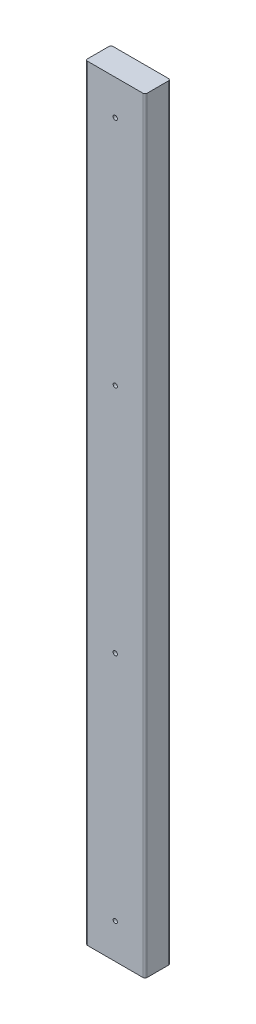
ISO-10303-21;
HEADER;
FILE_DESCRIPTION(('STEP AP214'),'2;1');
FILE_NAME('part.step','',(''),(''),'','','');
FILE_SCHEMA(('AUTOMOTIVE_DESIGN { 1 0 10303 214 1 1 1 1 }'));
ENDSEC;
DATA;
#1=APPLICATION_CONTEXT('core data for automotive mechanical design processes');
#2=APPLICATION_PROTOCOL_DEFINITION('international standard','automotive_design',2000,#1);
#3=PRODUCT_CONTEXT('',#1,'mechanical');
#4=PRODUCT('Part','Part','',(#3));
#5=PRODUCT_RELATED_PRODUCT_CATEGORY('part','',(#4));
#6=PRODUCT_DEFINITION_FORMATION('','',#4);
#7=PRODUCT_DEFINITION_CONTEXT('part definition',#1,'design');
#8=PRODUCT_DEFINITION('design','',#6,#7);
#9=PRODUCT_DEFINITION_SHAPE('','',#8);
#10=(LENGTH_UNIT() NAMED_UNIT(*) SI_UNIT(.MILLI.,.METRE.));
#11=(NAMED_UNIT(*) PLANE_ANGLE_UNIT() SI_UNIT($,.RADIAN.));
#12=(NAMED_UNIT(*) SI_UNIT($,.STERADIAN.) SOLID_ANGLE_UNIT());
#13=UNCERTAINTY_MEASURE_WITH_UNIT(LENGTH_MEASURE(1.E-05),#10,'distance_accuracy_value','');
#14=(GEOMETRIC_REPRESENTATION_CONTEXT(3) GLOBAL_UNCERTAINTY_ASSIGNED_CONTEXT((#13)) GLOBAL_UNIT_ASSIGNED_CONTEXT((#10,
#11,#12)) REPRESENTATION_CONTEXT('',''));
#15=CARTESIAN_POINT('',(0.,0.,0.));
#16=DIRECTION('',(0.,0.,1.));
#17=DIRECTION('',(1.,0.,0.));
#18=AXIS2_PLACEMENT_3D('',#15,#16,#17);
#19=CARTESIAN_POINT('',(-44.4500000000001,1143.,-19.0499999999992));
#20=DIRECTION('',(1.,0.,0.));
#21=DIRECTION('',(0.,0.,-1.));
#22=AXIS2_PLACEMENT_3D('',#19,#20,#21);
#23=PLANE('',#22);
#24=DIRECTION('',(0.,0.,1.));
#25=VECTOR('',#24,1.);
#26=CARTESIAN_POINT('',(-44.45,0.,-19.05));
#27=LINE('',#26,#25);
#28=CARTESIAN_POINT('',(-44.45,0.,-15.875));
#29=VERTEX_POINT('',#28);
#30=CARTESIAN_POINT('',(-44.45,0.,15.875));
#31=VERTEX_POINT('',#30);
#32=EDGE_CURVE('E127',#29,#31,#27,.T.);
#33=ORIENTED_EDGE('',*,*,#32,.T.);
#34=DIRECTION('',(0.,-1.,0.));
#35=VECTOR('',#34,1.);
#36=CARTESIAN_POINT('',(-44.45,1143.,15.8750000000008));
#37=LINE('',#36,#35);
#38=CARTESIAN_POINT('',(-44.45,1143.,15.8750000000008));
#39=VERTEX_POINT('',#38);
#40=EDGE_CURVE('E104',#31,#39,#37,.F.);
#41=ORIENTED_EDGE('',*,*,#40,.T.);
#42=DIRECTION('',(0.,0.,1.));
#43=VECTOR('',#42,1.);
#44=CARTESIAN_POINT('',(-44.4500000000001,1143.,-19.0499999999992));
#45=LINE('',#44,#43);
#46=CARTESIAN_POINT('',(-44.45,1143.,-15.8749999999992));
#47=VERTEX_POINT('',#46);
#48=EDGE_CURVE('E137',#47,#39,#45,.T.);
#49=ORIENTED_EDGE('',*,*,#48,.F.);
#50=DIRECTION('',(0.,-1.,0.));
#51=VECTOR('',#50,1.);
#52=CARTESIAN_POINT('',(-44.45,1143.,-15.8749999999992));
#53=LINE('',#52,#51);
#54=EDGE_CURVE('E109',#47,#29,#53,.T.);
#55=ORIENTED_EDGE('',*,*,#54,.T.);
#56=EDGE_LOOP('',(#33,#41,#49,#55));
#57=FACE_BOUND('',#56,.T.);
#58=ADVANCED_FACE('F32',(#57),#23,.F.);
#59=CARTESIAN_POINT('',(44.45,1143.,19.0500000000008));
#60=DIRECTION('',(0.,0.,-1.));
#61=DIRECTION('',(-1.,0.,0.));
#62=AXIS2_PLACEMENT_3D('',#59,#60,#61);
#63=PLANE('',#62);
#64=CARTESIAN_POINT('',(0.,52.3875,19.0499999999999));
#65=DIRECTION('',(0.,0.,-1.));
#66=DIRECTION('',(-1.,0.,0.));
#67=AXIS2_PLACEMENT_3D('',#64,#65,#66);
#68=CIRCLE('',#67,3.17499999999999);
#69=CARTESIAN_POINT('',(-3.17499999999999,52.3875,19.0499999999999));
#70=VERTEX_POINT('',#69);
#71=EDGE_CURVE('E196',#70,#70,#68,.T.);
#72=ORIENTED_EDGE('',*,*,#71,.T.);
#73=EDGE_LOOP('',(#72));
#74=FACE_BOUND('',#73,.T.);
#75=CARTESIAN_POINT('',(1.19348975147204E-12,398.4625,19.0500000000002));
#76=DIRECTION('',(0.,0.,-1.));
#77=DIRECTION('',(-1.,0.,0.));
#78=AXIS2_PLACEMENT_3D('',#75,#76,#77);
#79=CIRCLE('',#78,3.17499999999999);
#80=CARTESIAN_POINT('',(-3.1749999999988,398.4625,19.0500000000002));
#81=VERTEX_POINT('',#80);
#82=EDGE_CURVE('E190',#81,#81,#79,.T.);
#83=ORIENTED_EDGE('',*,*,#82,.T.);
#84=EDGE_LOOP('',(#83));
#85=FACE_BOUND('',#84,.T.);
#86=CARTESIAN_POINT('',(2.41473507855972E-12,744.5375,19.0500000000002));
#87=DIRECTION('',(0.,0.,-1.));
#88=DIRECTION('',(-1.,0.,0.));
#89=AXIS2_PLACEMENT_3D('',#86,#87,#88);
#90=CIRCLE('',#89,3.17499999999999);
#91=CARTESIAN_POINT('',(-3.17499999999758,744.5375,19.0500000000002));
#92=VERTEX_POINT('',#91);
#93=EDGE_CURVE('E184',#92,#92,#90,.T.);
#94=ORIENTED_EDGE('',*,*,#93,.T.);
#95=EDGE_LOOP('',(#94));
#96=FACE_BOUND('',#95,.T.);
#97=CARTESIAN_POINT('',(3.60822483003176E-12,1090.6125,19.0500000000006));
#98=DIRECTION('',(0.,0.,-1.));
#99=DIRECTION('',(-1.,0.,0.));
#100=AXIS2_PLACEMENT_3D('',#97,#98,#99);
#101=CIRCLE('',#100,3.17499999999999);
#102=CARTESIAN_POINT('',(-3.17499999999639,1090.6125,19.0500000000006));
#103=VERTEX_POINT('',#102);
#104=EDGE_CURVE('E132',#103,#103,#101,.T.);
#105=ORIENTED_EDGE('',*,*,#104,.T.);
#106=EDGE_LOOP('',(#105));
#107=FACE_BOUND('',#106,.T.);
#108=DIRECTION('',(1.,0.,0.));
#109=VECTOR('',#108,1.);
#110=CARTESIAN_POINT('',(44.45,1143.,19.0500000000008));
#111=LINE('',#110,#109);
#112=CARTESIAN_POINT('',(-41.275,1143.,19.0500000000008));
#113=VERTEX_POINT('',#112);
#114=CARTESIAN_POINT('',(41.2749999999999,1143.,19.0500000000008));
#115=VERTEX_POINT('',#114);
#116=EDGE_CURVE('E119',#113,#115,#111,.T.);
#117=ORIENTED_EDGE('',*,*,#116,.F.);
#118=DIRECTION('',(0.,-1.,0.));
#119=VECTOR('',#118,1.);
#120=CARTESIAN_POINT('',(-41.275,1143.,19.0500000000008));
#121=LINE('',#120,#119);
#122=CARTESIAN_POINT('',(-41.2749999999999,0.,19.05));
#123=VERTEX_POINT('',#122);
#124=EDGE_CURVE('E103',#113,#123,#121,.T.);
#125=ORIENTED_EDGE('',*,*,#124,.T.);
#126=DIRECTION('',(1.,0.,0.));
#127=VECTOR('',#126,1.);
#128=CARTESIAN_POINT('',(44.4499999999997,0.,19.0500000000002));
#129=LINE('',#128,#127);
#130=CARTESIAN_POINT('',(41.2749999999997,0.,19.0500000000002));
#131=VERTEX_POINT('',#130);
#132=EDGE_CURVE('E116',#123,#131,#129,.T.);
#133=ORIENTED_EDGE('',*,*,#132,.T.);
#134=DIRECTION('',(0.,-1.,0.));
#135=VECTOR('',#134,1.);
#136=CARTESIAN_POINT('',(41.2749999999999,1143.,19.0500000000008));
#137=LINE('',#136,#135);
#138=EDGE_CURVE('E121',#131,#115,#137,.F.);
#139=ORIENTED_EDGE('',*,*,#138,.T.);
#140=EDGE_LOOP('',(#117,#125,#133,#139));
#141=FACE_BOUND('',#140,.T.);
#142=ADVANCED_FACE('F115',(#74,#85,#96,#107,#141),#63,.F.);
#143=CARTESIAN_POINT('',(44.45,1143.,-19.0499999999992));
#144=DIRECTION('',(-1.,0.,0.));
#145=DIRECTION('',(0.,0.,1.));
#146=AXIS2_PLACEMENT_3D('',#143,#144,#145);
#147=PLANE('',#146);
#148=DIRECTION('',(0.,0.,-1.));
#149=VECTOR('',#148,1.);
#150=CARTESIAN_POINT('',(44.45,1143.,-19.0499999999992));
#151=LINE('',#150,#149);
#152=CARTESIAN_POINT('',(44.45,1143.,15.8750000000008));
#153=VERTEX_POINT('',#152);
#154=CARTESIAN_POINT('',(44.45,1143.,-15.8749999999992));
#155=VERTEX_POINT('',#154);
#156=EDGE_CURVE('E160',#153,#155,#151,.T.);
#157=ORIENTED_EDGE('',*,*,#156,.F.);
#158=DIRECTION('',(0.,-1.,0.));
#159=VECTOR('',#158,1.);
#160=CARTESIAN_POINT('',(44.45,1143.,15.8750000000008));
#161=LINE('',#160,#159);
#162=CARTESIAN_POINT('',(44.4499999999997,0.,15.8750000000003));
#163=VERTEX_POINT('',#162);
#164=EDGE_CURVE('E11',#153,#163,#161,.T.);
#165=ORIENTED_EDGE('',*,*,#164,.T.);
#166=DIRECTION('',(0.,0.,-1.));
#167=VECTOR('',#166,1.);
#168=CARTESIAN_POINT('',(44.45,0.,-19.0499999999997));
#169=LINE('',#168,#167);
#170=CARTESIAN_POINT('',(44.45,0.,-15.8749999999998));
#171=VERTEX_POINT('',#170);
#172=EDGE_CURVE('E126',#163,#171,#169,.T.);
#173=ORIENTED_EDGE('',*,*,#172,.T.);
#174=DIRECTION('',(0.,-1.,0.));
#175=VECTOR('',#174,1.);
#176=CARTESIAN_POINT('',(44.45,1143.,-15.8749999999992));
#177=LINE('',#176,#175);
#178=EDGE_CURVE('E40',#171,#155,#177,.F.);
#179=ORIENTED_EDGE('',*,*,#178,.T.);
#180=EDGE_LOOP('',(#157,#165,#173,#179));
#181=FACE_BOUND('',#180,.T.);
#182=ADVANCED_FACE('F159',(#181),#147,.F.);
#183=CARTESIAN_POINT('',(44.45,1143.,-19.0499999999992));
#184=DIRECTION('',(0.,0.,1.));
#185=DIRECTION('',(1.,0.,0.));
#186=AXIS2_PLACEMENT_3D('',#183,#184,#185);
#187=PLANE('',#186);
#188=CARTESIAN_POINT('',(-1.38777878078145E-13,52.3875,-19.05));
#189=DIRECTION('',(0.,0.,-1.));
#190=DIRECTION('',(-1.,0.,0.));
#191=AXIS2_PLACEMENT_3D('',#188,#189,#190);
#192=CIRCLE('',#191,3.17499999999999);
#193=CARTESIAN_POINT('',(-3.17500000000013,52.3875,-19.05));
#194=VERTEX_POINT('',#193);
#195=EDGE_CURVE('E199',#194,#194,#192,.T.);
#196=ORIENTED_EDGE('',*,*,#195,.F.);
#197=EDGE_LOOP('',(#196));
#198=FACE_BOUND('',#197,.T.);
#199=CARTESIAN_POINT('',(1.0547118733939E-12,398.4625,-19.0499999999997));
#200=DIRECTION('',(0.,0.,-1.));
#201=DIRECTION('',(-1.,0.,0.));
#202=AXIS2_PLACEMENT_3D('',#199,#200,#201);
#203=CIRCLE('',#202,3.17499999999999);
#204=CARTESIAN_POINT('',(-3.17499999999893,398.4625,-19.0499999999997));
#205=VERTEX_POINT('',#204);
#206=EDGE_CURVE('E193',#205,#205,#203,.T.);
#207=ORIENTED_EDGE('',*,*,#206,.F.);
#208=EDGE_LOOP('',(#207));
#209=FACE_BOUND('',#208,.T.);
#210=CARTESIAN_POINT('',(2.27595720048157E-12,744.5375,-19.0499999999997));
#211=DIRECTION('',(0.,0.,-1.));
#212=DIRECTION('',(-1.,0.,0.));
#213=AXIS2_PLACEMENT_3D('',#210,#211,#212);
#214=CIRCLE('',#213,3.17499999999999);
#215=CARTESIAN_POINT('',(-3.17499999999771,744.5375,-19.0499999999997));
#216=VERTEX_POINT('',#215);
#217=EDGE_CURVE('E187',#216,#216,#214,.T.);
#218=ORIENTED_EDGE('',*,*,#217,.F.);
#219=EDGE_LOOP('',(#218));
#220=FACE_BOUND('',#219,.T.);
#221=CARTESIAN_POINT('',(3.46944695195361E-12,1090.6125,-19.0499999999995));
#222=DIRECTION('',(0.,0.,-1.));
#223=DIRECTION('',(-1.,0.,0.));
#224=AXIS2_PLACEMENT_3D('',#221,#222,#223);
#225=CIRCLE('',#224,3.17499999999999);
#226=CARTESIAN_POINT('',(-3.17499999999652,1090.6125,-19.0499999999995));
#227=VERTEX_POINT('',#226);
#228=EDGE_CURVE('E181',#227,#227,#225,.T.);
#229=ORIENTED_EDGE('',*,*,#228,.F.);
#230=EDGE_LOOP('',(#229));
#231=FACE_BOUND('',#230,.T.);
#232=DIRECTION('',(-1.,0.,0.));
#233=VECTOR('',#232,1.);
#234=CARTESIAN_POINT('',(44.45,0.,-19.0499999999997));
#235=LINE('',#234,#233);
#236=CARTESIAN_POINT('',(41.275,0.,-19.0499999999997));
#237=VERTEX_POINT('',#236);
#238=CARTESIAN_POINT('',(-41.275,0.,-19.05));
#239=VERTEX_POINT('',#238);
#240=EDGE_CURVE('E130',#237,#239,#235,.T.);
#241=ORIENTED_EDGE('',*,*,#240,.T.);
#242=DIRECTION('',(0.,-1.,0.));
#243=VECTOR('',#242,1.);
#244=CARTESIAN_POINT('',(-41.2750000000001,1143.,-19.0499999999992));
#245=LINE('',#244,#243);
#246=CARTESIAN_POINT('',(-41.2750000000001,1143.,-19.0499999999992));
#247=VERTEX_POINT('',#246);
#248=EDGE_CURVE('E47',#239,#247,#245,.F.);
#249=ORIENTED_EDGE('',*,*,#248,.T.);
#250=DIRECTION('',(-1.,0.,0.));
#251=VECTOR('',#250,1.);
#252=CARTESIAN_POINT('',(44.45,1143.,-19.0499999999992));
#253=LINE('',#252,#251);
#254=CARTESIAN_POINT('',(41.275,1143.,-19.0499999999992));
#255=VERTEX_POINT('',#254);
#256=EDGE_CURVE('E138',#255,#247,#253,.T.);
#257=ORIENTED_EDGE('',*,*,#256,.F.);
#258=DIRECTION('',(0.,-1.,0.));
#259=VECTOR('',#258,1.);
#260=CARTESIAN_POINT('',(41.275,1143.,-19.0499999999992));
#261=LINE('',#260,#259);
#262=EDGE_CURVE('E153',#255,#237,#261,.T.);
#263=ORIENTED_EDGE('',*,*,#262,.T.);
#264=EDGE_LOOP('',(#241,#249,#257,#263));
#265=FACE_BOUND('',#264,.T.);
#266=ADVANCED_FACE('F169',(#198,#209,#220,#231,#265),#187,.F.);
#267=CARTESIAN_POINT('',(0.,1143.,5.55111512312578E-13));
#268=DIRECTION('',(0.,-1.,0.));
#269=DIRECTION('',(0.,0.,-1.));
#270=AXIS2_PLACEMENT_3D('',#267,#268,#269);
#271=PLANE('',#270);
#272=ORIENTED_EDGE('',*,*,#48,.T.);
#273=CARTESIAN_POINT('',(-41.275,1143.,15.8750000000008));
#274=DIRECTION('',(0.,-1.,0.));
#275=DIRECTION('',(0.,0.,-1.));
#276=AXIS2_PLACEMENT_3D('',#273,#274,#275);
#277=CIRCLE('',#276,3.175);
#278=EDGE_CURVE('E151',#39,#113,#277,.F.);
#279=ORIENTED_EDGE('',*,*,#278,.T.);
#280=ORIENTED_EDGE('',*,*,#116,.T.);
#281=CARTESIAN_POINT('',(41.2749999999999,1143.,15.8750000000008));
#282=DIRECTION('',(0.,-1.,0.));
#283=DIRECTION('',(0.,0.,-1.));
#284=AXIS2_PLACEMENT_3D('',#281,#282,#283);
#285=CIRCLE('',#284,3.175);
#286=EDGE_CURVE('E147',#115,#153,#285,.F.);
#287=ORIENTED_EDGE('',*,*,#286,.T.);
#288=ORIENTED_EDGE('',*,*,#156,.T.);
#289=CARTESIAN_POINT('',(41.275,1143.,-15.8749999999992));
#290=DIRECTION('',(0.,-1.,0.));
#291=DIRECTION('',(0.,0.,-1.));
#292=AXIS2_PLACEMENT_3D('',#289,#290,#291);
#293=CIRCLE('',#292,3.175);
#294=EDGE_CURVE('E54',#155,#255,#293,.F.);
#295=ORIENTED_EDGE('',*,*,#294,.T.);
#296=ORIENTED_EDGE('',*,*,#256,.T.);
#297=CARTESIAN_POINT('',(-41.275,1143.,-15.8749999999992));
#298=DIRECTION('',(0.,-1.,0.));
#299=DIRECTION('',(0.,0.,-1.));
#300=AXIS2_PLACEMENT_3D('',#297,#298,#299);
#301=CIRCLE('',#300,3.175);
#302=EDGE_CURVE('E149',#247,#47,#301,.F.);
#303=ORIENTED_EDGE('',*,*,#302,.T.);
#304=EDGE_LOOP('',(#272,#279,#280,#287,#288,#295,#296,#303));
#305=FACE_BOUND('',#304,.T.);
#306=ADVANCED_FACE('F164',(#305),#271,.F.);
#307=CARTESIAN_POINT('',(0.,0.,0.));
#308=DIRECTION('',(0.,-1.,0.));
#309=DIRECTION('',(0.,0.,-1.));
#310=AXIS2_PLACEMENT_3D('',#307,#308,#309);
#311=PLANE('',#310);
#312=ORIENTED_EDGE('',*,*,#132,.F.);
#313=CARTESIAN_POINT('',(-41.275,0.,15.875));
#314=DIRECTION('',(0.,-1.,0.));
#315=DIRECTION('',(0.,0.,-1.));
#316=AXIS2_PLACEMENT_3D('',#313,#314,#315);
#317=CIRCLE('',#316,3.175);
#318=EDGE_CURVE('E99',#123,#31,#317,.T.);
#319=ORIENTED_EDGE('',*,*,#318,.T.);
#320=ORIENTED_EDGE('',*,*,#32,.F.);
#321=CARTESIAN_POINT('',(-41.275,0.,-15.875));
#322=DIRECTION('',(0.,-1.,0.));
#323=DIRECTION('',(0.,0.,-1.));
#324=AXIS2_PLACEMENT_3D('',#321,#322,#323);
#325=CIRCLE('',#324,3.175);
#326=EDGE_CURVE('E110',#29,#239,#325,.T.);
#327=ORIENTED_EDGE('',*,*,#326,.T.);
#328=ORIENTED_EDGE('',*,*,#240,.F.);
#329=CARTESIAN_POINT('',(41.275,0.,-15.8749999999998));
#330=DIRECTION('',(0.,-1.,0.));
#331=DIRECTION('',(0.,0.,-1.));
#332=AXIS2_PLACEMENT_3D('',#329,#330,#331);
#333=CIRCLE('',#332,3.175);
#334=EDGE_CURVE('E120',#237,#171,#333,.T.);
#335=ORIENTED_EDGE('',*,*,#334,.T.);
#336=ORIENTED_EDGE('',*,*,#172,.F.);
#337=CARTESIAN_POINT('',(41.2749999999997,0.,15.8750000000003));
#338=DIRECTION('',(0.,-1.,0.));
#339=DIRECTION('',(0.,0.,-1.));
#340=AXIS2_PLACEMENT_3D('',#337,#338,#339);
#341=CIRCLE('',#340,3.175);
#342=EDGE_CURVE('E125',#163,#131,#341,.T.);
#343=ORIENTED_EDGE('',*,*,#342,.T.);
#344=EDGE_LOOP('',(#312,#319,#320,#327,#328,#335,#336,#343));
#345=FACE_BOUND('',#344,.T.);
#346=ADVANCED_FACE('F123',(#345),#311,.T.);
#347=CARTESIAN_POINT('',(3.46944695195361E-12,1090.6125,-19.0499999999995));
#348=DIRECTION('',(0.,0.,-1.));
#349=DIRECTION('',(-1.,0.,0.));
#350=AXIS2_PLACEMENT_3D('',#347,#348,#349);
#351=CYLINDRICAL_SURFACE('',#350,3.17499999999999);
#352=ORIENTED_EDGE('',*,*,#104,.F.);
#353=EDGE_LOOP('',(#352));
#354=FACE_BOUND('',#353,.T.);
#355=ORIENTED_EDGE('',*,*,#228,.T.);
#356=EDGE_LOOP('',(#355));
#357=FACE_BOUND('',#356,.T.);
#358=ADVANCED_FACE('F214',(#354,#357),#351,.F.);
#359=CARTESIAN_POINT('',(2.27595720048157E-12,744.5375,-19.0499999999997));
#360=DIRECTION('',(0.,0.,-1.));
#361=DIRECTION('',(-1.,0.,0.));
#362=AXIS2_PLACEMENT_3D('',#359,#360,#361);
#363=CYLINDRICAL_SURFACE('',#362,3.17499999999999);
#364=ORIENTED_EDGE('',*,*,#93,.F.);
#365=EDGE_LOOP('',(#364));
#366=FACE_BOUND('',#365,.T.);
#367=ORIENTED_EDGE('',*,*,#217,.T.);
#368=EDGE_LOOP('',(#367));
#369=FACE_BOUND('',#368,.T.);
#370=ADVANCED_FACE('F216',(#366,#369),#363,.F.);
#371=CARTESIAN_POINT('',(1.0547118733939E-12,398.4625,-19.0499999999997));
#372=DIRECTION('',(0.,0.,-1.));
#373=DIRECTION('',(-1.,0.,0.));
#374=AXIS2_PLACEMENT_3D('',#371,#372,#373);
#375=CYLINDRICAL_SURFACE('',#374,3.17499999999999);
#376=ORIENTED_EDGE('',*,*,#82,.F.);
#377=EDGE_LOOP('',(#376));
#378=FACE_BOUND('',#377,.T.);
#379=ORIENTED_EDGE('',*,*,#206,.T.);
#380=EDGE_LOOP('',(#379));
#381=FACE_BOUND('',#380,.T.);
#382=ADVANCED_FACE('F223',(#378,#381),#375,.F.);
#383=CARTESIAN_POINT('',(-1.38777878078145E-13,52.3875,-19.05));
#384=DIRECTION('',(0.,0.,-1.));
#385=DIRECTION('',(-1.,0.,0.));
#386=AXIS2_PLACEMENT_3D('',#383,#384,#385);
#387=CYLINDRICAL_SURFACE('',#386,3.17499999999999);
#388=ORIENTED_EDGE('',*,*,#71,.F.);
#389=EDGE_LOOP('',(#388));
#390=FACE_BOUND('',#389,.T.);
#391=ORIENTED_EDGE('',*,*,#195,.T.);
#392=EDGE_LOOP('',(#391));
#393=FACE_BOUND('',#392,.T.);
#394=ADVANCED_FACE('F203',(#390,#393),#387,.F.);
#395=CARTESIAN_POINT('',(-41.275,1143.,15.8750000000008));
#396=DIRECTION('',(0.,-1.,0.));
#397=DIRECTION('',(0.,0.,-1.));
#398=AXIS2_PLACEMENT_3D('',#395,#396,#397);
#399=CYLINDRICAL_SURFACE('',#398,3.175);
#400=ORIENTED_EDGE('',*,*,#278,.F.);
#401=ORIENTED_EDGE('',*,*,#40,.F.);
#402=ORIENTED_EDGE('',*,*,#318,.F.);
#403=ORIENTED_EDGE('',*,*,#124,.F.);
#404=EDGE_LOOP('',(#400,#401,#402,#403));
#405=FACE_BOUND('',#404,.T.);
#406=ADVANCED_FACE('F102',(#405),#399,.T.);
#407=CARTESIAN_POINT('',(-41.275,1143.,-15.8749999999992));
#408=DIRECTION('',(0.,-1.,0.));
#409=DIRECTION('',(0.,0.,-1.));
#410=AXIS2_PLACEMENT_3D('',#407,#408,#409);
#411=CYLINDRICAL_SURFACE('',#410,3.175);
#412=ORIENTED_EDGE('',*,*,#302,.F.);
#413=ORIENTED_EDGE('',*,*,#248,.F.);
#414=ORIENTED_EDGE('',*,*,#326,.F.);
#415=ORIENTED_EDGE('',*,*,#54,.F.);
#416=EDGE_LOOP('',(#412,#413,#414,#415));
#417=FACE_BOUND('',#416,.T.);
#418=ADVANCED_FACE('F173',(#417),#411,.T.);
#419=CARTESIAN_POINT('',(41.2749999999999,1143.,15.8750000000008));
#420=DIRECTION('',(0.,-1.,0.));
#421=DIRECTION('',(0.,0.,-1.));
#422=AXIS2_PLACEMENT_3D('',#419,#420,#421);
#423=CYLINDRICAL_SURFACE('',#422,3.175);
#424=ORIENTED_EDGE('',*,*,#286,.F.);
#425=ORIENTED_EDGE('',*,*,#138,.F.);
#426=ORIENTED_EDGE('',*,*,#342,.F.);
#427=ORIENTED_EDGE('',*,*,#164,.F.);
#428=EDGE_LOOP('',(#424,#425,#426,#427));
#429=FACE_BOUND('',#428,.T.);
#430=ADVANCED_FACE('F241',(#429),#423,.T.);
#431=CARTESIAN_POINT('',(41.275,1143.,-15.8749999999992));
#432=DIRECTION('',(0.,-1.,0.));
#433=DIRECTION('',(0.,0.,-1.));
#434=AXIS2_PLACEMENT_3D('',#431,#432,#433);
#435=CYLINDRICAL_SURFACE('',#434,3.175);
#436=ORIENTED_EDGE('',*,*,#294,.F.);
#437=ORIENTED_EDGE('',*,*,#178,.F.);
#438=ORIENTED_EDGE('',*,*,#334,.F.);
#439=ORIENTED_EDGE('',*,*,#262,.F.);
#440=EDGE_LOOP('',(#436,#437,#438,#439));
#441=FACE_BOUND('',#440,.T.);
#442=ADVANCED_FACE('F34',(#441),#435,.T.);
#443=CLOSED_SHELL('',(#58,#142,#182,#266,#306,#346,#358,#370,#382,#394,#406,#418,#430,#442));
#444=MANIFOLD_SOLID_BREP('B2',#443);
#445=ADVANCED_BREP_SHAPE_REPRESENTATION('',(#18,#444),#14);
#446=SHAPE_DEFINITION_REPRESENTATION(#9,#445);
ENDSEC;
END-ISO-10303-21;
